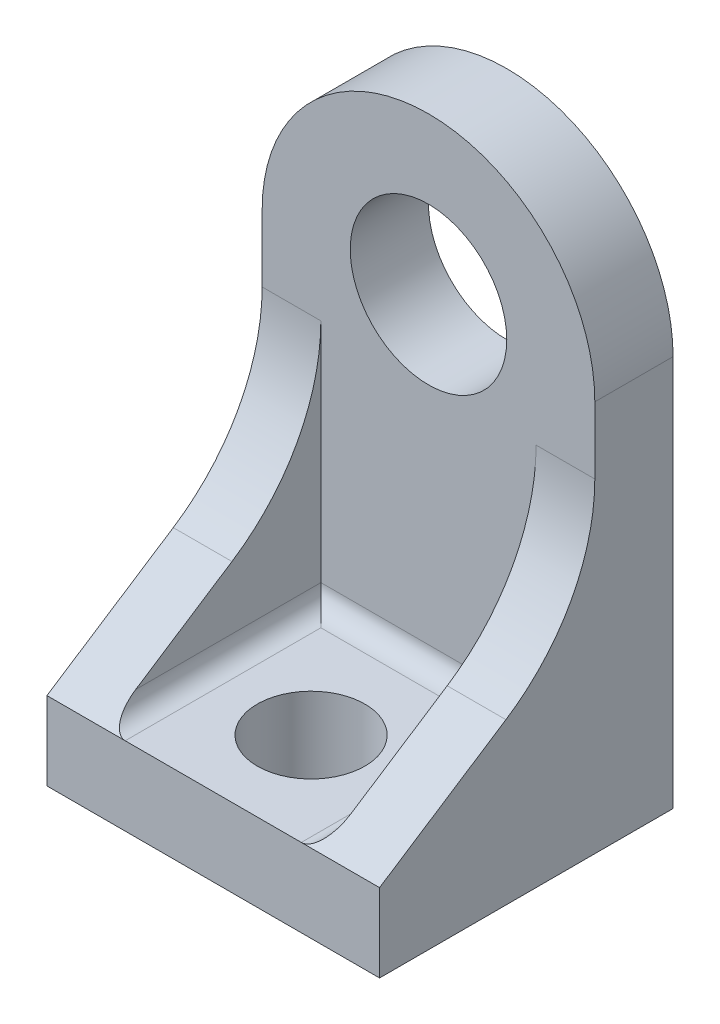
ISO-10303-21;
HEADER;
FILE_DESCRIPTION(('STEP AP214'),'2;1');
FILE_NAME('part.step','',(''),(''),'','','');
FILE_SCHEMA(('AUTOMOTIVE_DESIGN { 1 0 10303 214 1 1 1 1 }'));
ENDSEC;
DATA;
#1=APPLICATION_CONTEXT('core data for automotive mechanical design processes');
#2=APPLICATION_PROTOCOL_DEFINITION('international standard','automotive_design',2000,#1);
#3=PRODUCT_CONTEXT('',#1,'mechanical');
#4=PRODUCT('Part','Part','',(#3));
#5=PRODUCT_RELATED_PRODUCT_CATEGORY('part','',(#4));
#6=PRODUCT_DEFINITION_FORMATION('','',#4);
#7=PRODUCT_DEFINITION_CONTEXT('part definition',#1,'design');
#8=PRODUCT_DEFINITION('design','',#6,#7);
#9=PRODUCT_DEFINITION_SHAPE('','',#8);
#10=(LENGTH_UNIT() NAMED_UNIT(*) SI_UNIT(.MILLI.,.METRE.));
#11=(NAMED_UNIT(*) PLANE_ANGLE_UNIT() SI_UNIT($,.RADIAN.));
#12=(NAMED_UNIT(*) SI_UNIT($,.STERADIAN.) SOLID_ANGLE_UNIT());
#13=UNCERTAINTY_MEASURE_WITH_UNIT(LENGTH_MEASURE(1.E-05),#10,'distance_accuracy_value','');
#14=(GEOMETRIC_REPRESENTATION_CONTEXT(3) GLOBAL_UNCERTAINTY_ASSIGNED_CONTEXT((#13)) GLOBAL_UNIT_ASSIGNED_CONTEXT((#10,
#11,#12)) REPRESENTATION_CONTEXT('',''));
#15=CARTESIAN_POINT('',(0.,0.,0.));
#16=DIRECTION('',(0.,0.,1.));
#17=DIRECTION('',(1.,0.,0.));
#18=AXIS2_PLACEMENT_3D('',#15,#16,#17);
#19=CARTESIAN_POINT('',(-8.5,0.,15.));
#20=DIRECTION('',(1.,0.,0.));
#21=DIRECTION('',(0.,0.,-1.));
#22=AXIS2_PLACEMENT_3D('',#19,#20,#21);
#23=PLANE('',#22);
#24=DIRECTION('',(0.,0.545692634920528,-0.83798541048964));
#25=VECTOR('',#24,1.);
#26=CARTESIAN_POINT('',(-8.5,3.99999999999999,15.));
#27=LINE('',#26,#25);
#28=CARTESIAN_POINT('',(-8.5,3.99999999999999,15.));
#29=VERTEX_POINT('',#28);
#30=CARTESIAN_POINT('',(-8.5,8.20472374444659,8.54307365079472));
#31=VERTEX_POINT('',#30);
#32=EDGE_CURVE('E157',#29,#31,#27,.T.);
#33=ORIENTED_EDGE('',*,*,#32,.T.);
#34=CARTESIAN_POINT('',(-8.5,16.584577849343,14.));
#35=DIRECTION('',(1.,0.,0.));
#36=DIRECTION('',(0.,0.,-1.));
#37=AXIS2_PLACEMENT_3D('',#34,#35,#36);
#38=CIRCLE('',#37,10.);
#39=CARTESIAN_POINT('',(-8.50000000000001,16.584577849343,4.));
#40=VERTEX_POINT('',#39);
#41=EDGE_CURVE('E247',#31,#40,#38,.T.);
#42=ORIENTED_EDGE('',*,*,#41,.T.);
#43=DIRECTION('',(0.,1.,0.));
#44=VECTOR('',#43,1.);
#45=CARTESIAN_POINT('',(-8.5,11.1631545239176,4.));
#46=LINE('',#45,#44);
#47=CARTESIAN_POINT('',(-8.50000000000001,20.,4.));
#48=VERTEX_POINT('',#47);
#49=EDGE_CURVE('E161',#40,#48,#46,.T.);
#50=ORIENTED_EDGE('',*,*,#49,.T.);
#51=DIRECTION('',(0.,0.,-1.));
#52=VECTOR('',#51,1.);
#53=CARTESIAN_POINT('',(-8.5,20.,15.));
#54=LINE('',#53,#52);
#55=CARTESIAN_POINT('',(-8.5,20.,0.));
#56=VERTEX_POINT('',#55);
#57=EDGE_CURVE('E201',#48,#56,#54,.T.);
#58=ORIENTED_EDGE('',*,*,#57,.T.);
#59=DIRECTION('',(0.,-1.,0.));
#60=VECTOR('',#59,1.);
#61=CARTESIAN_POINT('',(-8.5,0.,0.));
#62=LINE('',#61,#60);
#63=CARTESIAN_POINT('',(-8.5,0.,0.));
#64=VERTEX_POINT('',#63);
#65=EDGE_CURVE('E186',#56,#64,#62,.T.);
#66=ORIENTED_EDGE('',*,*,#65,.T.);
#67=DIRECTION('',(0.,0.,-1.));
#68=VECTOR('',#67,1.);
#69=CARTESIAN_POINT('',(-8.5,0.,15.));
#70=LINE('',#69,#68);
#71=CARTESIAN_POINT('',(-8.5,0.,15.));
#72=VERTEX_POINT('',#71);
#73=EDGE_CURVE('E227',#72,#64,#70,.T.);
#74=ORIENTED_EDGE('',*,*,#73,.F.);
#75=DIRECTION('',(0.,-1.,0.));
#76=VECTOR('',#75,1.);
#77=CARTESIAN_POINT('',(-8.5,0.,15.));
#78=LINE('',#77,#76);
#79=EDGE_CURVE('E189',#29,#72,#78,.T.);
#80=ORIENTED_EDGE('',*,*,#79,.F.);
#81=EDGE_LOOP('',(#33,#42,#50,#58,#66,#74,#80));
#82=FACE_BOUND('',#81,.T.);
#83=ADVANCED_FACE('F39',(#82),#23,.F.);
#84=CARTESIAN_POINT('',(-8.5,0.,15.));
#85=DIRECTION('',(0.,1.,0.));
#86=DIRECTION('',(0.,0.,1.));
#87=AXIS2_PLACEMENT_3D('',#84,#85,#86);
#88=PLANE('',#87);
#89=CARTESIAN_POINT('',(0.,0.,10.));
#90=DIRECTION('',(0.,1.,0.));
#91=DIRECTION('',(0.,0.,1.));
#92=AXIS2_PLACEMENT_3D('',#89,#90,#91);
#93=CIRCLE('',#92,2.75);
#94=CARTESIAN_POINT('',(0.,0.,12.75));
#95=VERTEX_POINT('',#94);
#96=EDGE_CURVE('E141',#95,#95,#93,.T.);
#97=ORIENTED_EDGE('',*,*,#96,.T.);
#98=EDGE_LOOP('',(#97));
#99=FACE_BOUND('',#98,.T.);
#100=DIRECTION('',(1.,0.,0.));
#101=VECTOR('',#100,1.);
#102=CARTESIAN_POINT('',(-8.5,0.,0.));
#103=LINE('',#102,#101);
#104=CARTESIAN_POINT('',(8.5,0.,0.));
#105=VERTEX_POINT('',#104);
#106=EDGE_CURVE('E205',#64,#105,#103,.T.);
#107=ORIENTED_EDGE('',*,*,#106,.T.);
#108=DIRECTION('',(0.,0.,-1.));
#109=VECTOR('',#108,1.);
#110=CARTESIAN_POINT('',(8.5,0.,15.));
#111=LINE('',#110,#109);
#112=CARTESIAN_POINT('',(8.5,0.,15.));
#113=VERTEX_POINT('',#112);
#114=EDGE_CURVE('E223',#113,#105,#111,.T.);
#115=ORIENTED_EDGE('',*,*,#114,.F.);
#116=DIRECTION('',(1.,0.,0.));
#117=VECTOR('',#116,1.);
#118=CARTESIAN_POINT('',(-8.5,0.,15.));
#119=LINE('',#118,#117);
#120=EDGE_CURVE('E193',#72,#113,#119,.T.);
#121=ORIENTED_EDGE('',*,*,#120,.F.);
#122=ORIENTED_EDGE('',*,*,#73,.T.);
#123=EDGE_LOOP('',(#107,#115,#121,#122));
#124=FACE_BOUND('',#123,.T.);
#125=ADVANCED_FACE('F288',(#99,#124),#88,.F.);
#126=CARTESIAN_POINT('',(8.5,0.,15.));
#127=DIRECTION('',(-1.,0.,0.));
#128=DIRECTION('',(0.,-1.,0.));
#129=AXIS2_PLACEMENT_3D('',#126,#127,#128);
#130=PLANE('',#129);
#131=DIRECTION('',(0.,0.,-1.));
#132=VECTOR('',#131,1.);
#133=CARTESIAN_POINT('',(8.5,20.,15.));
#134=LINE('',#133,#132);
#135=CARTESIAN_POINT('',(8.49999999999999,20.,4.));
#136=VERTEX_POINT('',#135);
#137=CARTESIAN_POINT('',(8.5,20.,0.));
#138=VERTEX_POINT('',#137);
#139=EDGE_CURVE('E219',#136,#138,#134,.T.);
#140=ORIENTED_EDGE('',*,*,#139,.F.);
#141=DIRECTION('',(0.,1.,0.));
#142=VECTOR('',#141,1.);
#143=CARTESIAN_POINT('',(8.5,11.1631545239176,4.));
#144=LINE('',#143,#142);
#145=CARTESIAN_POINT('',(8.49999999999999,16.584577849343,4.));
#146=VERTEX_POINT('',#145);
#147=EDGE_CURVE('E162',#146,#136,#144,.T.);
#148=ORIENTED_EDGE('',*,*,#147,.F.);
#149=CARTESIAN_POINT('',(8.5,16.584577849343,14.));
#150=DIRECTION('',(-1.,0.,0.));
#151=DIRECTION('',(0.,-1.,0.));
#152=AXIS2_PLACEMENT_3D('',#149,#150,#151);
#153=CIRCLE('',#152,10.);
#154=CARTESIAN_POINT('',(8.5,8.20472374444659,8.54307365079472));
#155=VERTEX_POINT('',#154);
#156=EDGE_CURVE('E251',#146,#155,#153,.T.);
#157=ORIENTED_EDGE('',*,*,#156,.T.);
#158=DIRECTION('',(0.,0.545692634920528,-0.83798541048964));
#159=VECTOR('',#158,1.);
#160=CARTESIAN_POINT('',(8.5,4.,15.));
#161=LINE('',#160,#159);
#162=CARTESIAN_POINT('',(8.5,4.,15.));
#163=VERTEX_POINT('',#162);
#164=EDGE_CURVE('E145',#163,#155,#161,.T.);
#165=ORIENTED_EDGE('',*,*,#164,.F.);
#166=DIRECTION('',(0.,1.,0.));
#167=VECTOR('',#166,1.);
#168=CARTESIAN_POINT('',(8.5,0.,15.));
#169=LINE('',#168,#167);
#170=EDGE_CURVE('E198',#113,#163,#169,.T.);
#171=ORIENTED_EDGE('',*,*,#170,.F.);
#172=ORIENTED_EDGE('',*,*,#114,.T.);
#173=DIRECTION('',(0.,1.,0.));
#174=VECTOR('',#173,1.);
#175=CARTESIAN_POINT('',(8.5,0.,0.));
#176=LINE('',#175,#174);
#177=EDGE_CURVE('E209',#105,#138,#176,.T.);
#178=ORIENTED_EDGE('',*,*,#177,.T.);
#179=EDGE_LOOP('',(#140,#148,#157,#165,#171,#172,#178));
#180=FACE_BOUND('',#179,.T.);
#181=ADVANCED_FACE('F342',(#180),#130,.F.);
#182=CARTESIAN_POINT('',(0.,20.,15.));
#183=DIRECTION('',(0.,0.,-1.));
#184=DIRECTION('',(-1.,0.,0.));
#185=AXIS2_PLACEMENT_3D('',#182,#183,#184);
#186=CYLINDRICAL_SURFACE('',#185,8.5);
#187=ORIENTED_EDGE('',*,*,#57,.F.);
#188=CARTESIAN_POINT('',(0.,20.,4.));
#189=DIRECTION('',(0.,0.,1.));
#190=DIRECTION('',(-1.,0.,0.));
#191=AXIS2_PLACEMENT_3D('',#188,#189,#190);
#192=CIRCLE('',#191,8.5);
#193=EDGE_CURVE('E182',#136,#48,#192,.T.);
#194=ORIENTED_EDGE('',*,*,#193,.F.);
#195=ORIENTED_EDGE('',*,*,#139,.T.);
#196=CARTESIAN_POINT('',(0.,20.,0.));
#197=DIRECTION('',(0.,0.,1.));
#198=DIRECTION('',(-1.,0.,0.));
#199=AXIS2_PLACEMENT_3D('',#196,#197,#198);
#200=CIRCLE('',#199,8.5);
#201=EDGE_CURVE('E194',#138,#56,#200,.T.);
#202=ORIENTED_EDGE('',*,*,#201,.T.);
#203=EDGE_LOOP('',(#187,#194,#195,#202));
#204=FACE_BOUND('',#203,.T.);
#205=ADVANCED_FACE('F322',(#204),#186,.T.);
#206=CARTESIAN_POINT('',(0.,20.,15.));
#207=DIRECTION('',(0.,0.,-1.));
#208=DIRECTION('',(-1.,0.,0.));
#209=AXIS2_PLACEMENT_3D('',#206,#207,#208);
#210=PLANE('',#209);
#211=ORIENTED_EDGE('',*,*,#170,.T.);
#212=DIRECTION('',(1.,0.,0.));
#213=VECTOR('',#212,1.);
#214=CARTESIAN_POINT('',(-8.5,3.99999999999999,15.));
#215=LINE('',#214,#213);
#216=CARTESIAN_POINT('',(4.5,4.,15.));
#217=VERTEX_POINT('',#216);
#218=EDGE_CURVE('E57',#217,#163,#215,.T.);
#219=ORIENTED_EDGE('',*,*,#218,.F.);
#220=DIRECTION('',(1.,0.,0.));
#221=VECTOR('',#220,1.);
#222=CARTESIAN_POINT('',(-5.5,4.,15.));
#223=LINE('',#222,#221);
#224=CARTESIAN_POINT('',(-4.5,3.99999999999999,15.));
#225=VERTEX_POINT('',#224);
#226=EDGE_CURVE('E122',#225,#217,#223,.T.);
#227=ORIENTED_EDGE('',*,*,#226,.F.);
#228=EDGE_CURVE('E80',#29,#225,#215,.T.);
#229=ORIENTED_EDGE('',*,*,#228,.F.);
#230=ORIENTED_EDGE('',*,*,#79,.T.);
#231=ORIENTED_EDGE('',*,*,#120,.T.);
#232=EDGE_LOOP('',(#211,#219,#227,#229,#230,#231));
#233=FACE_BOUND('',#232,.T.);
#234=ADVANCED_FACE('F270',(#233),#210,.F.);
#235=CARTESIAN_POINT('',(0.,20.,0.));
#236=DIRECTION('',(0.,0.,-1.));
#237=DIRECTION('',(-1.,0.,0.));
#238=AXIS2_PLACEMENT_3D('',#235,#236,#237);
#239=PLANE('',#238);
#240=CARTESIAN_POINT('',(0.,20.5,0.));
#241=DIRECTION('',(0.,0.,1.));
#242=DIRECTION('',(1.,0.,0.));
#243=AXIS2_PLACEMENT_3D('',#240,#241,#242);
#244=CIRCLE('',#243,4.);
#245=CARTESIAN_POINT('',(4.,20.5,0.));
#246=VERTEX_POINT('',#245);
#247=EDGE_CURVE('E153',#246,#246,#244,.T.);
#248=ORIENTED_EDGE('',*,*,#247,.T.);
#249=EDGE_LOOP('',(#248));
#250=FACE_BOUND('',#249,.T.);
#251=ORIENTED_EDGE('',*,*,#65,.F.);
#252=ORIENTED_EDGE('',*,*,#201,.F.);
#253=ORIENTED_EDGE('',*,*,#177,.F.);
#254=ORIENTED_EDGE('',*,*,#106,.F.);
#255=EDGE_LOOP('',(#251,#252,#253,#254));
#256=FACE_BOUND('',#255,.T.);
#257=ADVANCED_FACE('F324',(#250,#256),#239,.T.);
#258=CARTESIAN_POINT('',(-5.5,26.4807406984079,4.));
#259=DIRECTION('',(-1.,0.,0.));
#260=DIRECTION('',(0.,-1.,0.));
#261=AXIS2_PLACEMENT_3D('',#258,#259,#260);
#262=PLANE('',#261);
#263=DIRECTION('',(0.,-0.545692634920528,0.83798541048964));
#264=VECTOR('',#263,1.);
#265=CARTESIAN_POINT('',(-5.5,15.7244322555424,-3.00446358937859));
#266=LINE('',#265,#264);
#267=CARTESIAN_POINT('',(-5.5,8.20472374444659,8.54307365079472));
#268=VERTEX_POINT('',#267);
#269=CARTESIAN_POINT('',(-5.5,5.,13.4643637152778));
#270=VERTEX_POINT('',#269);
#271=EDGE_CURVE('E106',#268,#270,#266,.T.);
#272=ORIENTED_EDGE('',*,*,#271,.T.);
#273=DIRECTION('',(0.,0.,1.));
#274=VECTOR('',#273,1.);
#275=CARTESIAN_POINT('',(-5.5,5.,4.));
#276=LINE('',#275,#274);
#277=CARTESIAN_POINT('',(-5.5,5.,4.));
#278=VERTEX_POINT('',#277);
#279=EDGE_CURVE('E118',#270,#278,#276,.F.);
#280=ORIENTED_EDGE('',*,*,#279,.T.);
#281=DIRECTION('',(0.,-1.,0.));
#282=VECTOR('',#281,1.);
#283=CARTESIAN_POINT('',(-5.5,26.4807406984079,4.));
#284=LINE('',#283,#282);
#285=CARTESIAN_POINT('',(-5.5,16.584577849343,4.));
#286=VERTEX_POINT('',#285);
#287=EDGE_CURVE('E176',#286,#278,#284,.T.);
#288=ORIENTED_EDGE('',*,*,#287,.F.);
#289=CARTESIAN_POINT('',(-5.5,16.584577849343,14.));
#290=DIRECTION('',(-1.,0.,0.));
#291=DIRECTION('',(0.,-1.,0.));
#292=AXIS2_PLACEMENT_3D('',#289,#290,#291);
#293=CIRCLE('',#292,10.);
#294=EDGE_CURVE('E120',#286,#268,#293,.T.);
#295=ORIENTED_EDGE('',*,*,#294,.T.);
#296=EDGE_LOOP('',(#272,#280,#288,#295));
#297=FACE_BOUND('',#296,.T.);
#298=ADVANCED_FACE('F116',(#297),#262,.F.);
#299=CARTESIAN_POINT('',(5.5,4.,4.));
#300=DIRECTION('',(1.,0.,0.));
#301=DIRECTION('',(0.,1.,0.));
#302=AXIS2_PLACEMENT_3D('',#299,#300,#301);
#303=PLANE('',#302);
#304=DIRECTION('',(0.,1.,0.));
#305=VECTOR('',#304,1.);
#306=CARTESIAN_POINT('',(5.5,4.,4.));
#307=LINE('',#306,#305);
#308=CARTESIAN_POINT('',(5.5,5.,4.));
#309=VERTEX_POINT('',#308);
#310=CARTESIAN_POINT('',(5.5,16.584577849343,4.));
#311=VERTEX_POINT('',#310);
#312=EDGE_CURVE('E179',#309,#311,#307,.T.);
#313=ORIENTED_EDGE('',*,*,#312,.F.);
#314=DIRECTION('',(0.,0.,1.));
#315=VECTOR('',#314,1.);
#316=CARTESIAN_POINT('',(5.5,5.,15.));
#317=LINE('',#316,#315);
#318=CARTESIAN_POINT('',(5.5,5.,13.4643637152778));
#319=VERTEX_POINT('',#318);
#320=EDGE_CURVE('E129',#309,#319,#317,.T.);
#321=ORIENTED_EDGE('',*,*,#320,.T.);
#322=DIRECTION('',(0.,0.545692634920528,-0.83798541048964));
#323=VECTOR('',#322,1.);
#324=CARTESIAN_POINT('',(5.5,9.03010713342557,7.27558496987159));
#325=LINE('',#324,#323);
#326=CARTESIAN_POINT('',(5.5,8.20472374444659,8.54307365079472));
#327=VERTEX_POINT('',#326);
#328=EDGE_CURVE('E91',#319,#327,#325,.T.);
#329=ORIENTED_EDGE('',*,*,#328,.T.);
#330=CARTESIAN_POINT('',(5.5,16.584577849343,14.));
#331=DIRECTION('',(1.,0.,0.));
#332=DIRECTION('',(0.,1.,0.));
#333=AXIS2_PLACEMENT_3D('',#330,#331,#332);
#334=CIRCLE('',#333,10.);
#335=EDGE_CURVE('E254',#327,#311,#334,.T.);
#336=ORIENTED_EDGE('',*,*,#335,.T.);
#337=EDGE_LOOP('',(#313,#321,#329,#336));
#338=FACE_BOUND('',#337,.T.);
#339=ADVANCED_FACE('F332',(#338),#303,.F.);
#340=CARTESIAN_POINT('',(-5.5,4.,4.));
#341=DIRECTION('',(0.,-1.,0.));
#342=DIRECTION('',(0.,0.,-1.));
#343=AXIS2_PLACEMENT_3D('',#340,#341,#342);
#344=PLANE('',#343);
#345=CARTESIAN_POINT('',(0.,4.,10.));
#346=DIRECTION('',(0.,1.,0.));
#347=DIRECTION('',(0.,0.,1.));
#348=AXIS2_PLACEMENT_3D('',#345,#346,#347);
#349=CIRCLE('',#348,2.75);
#350=CARTESIAN_POINT('',(0.,4.,12.75));
#351=VERTEX_POINT('',#350);
#352=EDGE_CURVE('E147',#351,#351,#349,.T.);
#353=ORIENTED_EDGE('',*,*,#352,.F.);
#354=EDGE_LOOP('',(#353));
#355=FACE_BOUND('',#354,.T.);
#356=DIRECTION('',(1.,0.,0.));
#357=VECTOR('',#356,1.);
#358=CARTESIAN_POINT('',(-5.5,4.,5.));
#359=LINE('',#358,#357);
#360=CARTESIAN_POINT('',(4.5,4.,5.));
#361=VERTEX_POINT('',#360);
#362=CARTESIAN_POINT('',(-4.5,4.,5.));
#363=VERTEX_POINT('',#362);
#364=EDGE_CURVE('E257',#361,#363,#359,.F.);
#365=ORIENTED_EDGE('',*,*,#364,.T.);
#366=DIRECTION('',(0.,0.,1.));
#367=VECTOR('',#366,1.);
#368=CARTESIAN_POINT('',(-4.5,4.,15.));
#369=LINE('',#368,#367);
#370=EDGE_CURVE('E130',#363,#225,#369,.T.);
#371=ORIENTED_EDGE('',*,*,#370,.T.);
#372=ORIENTED_EDGE('',*,*,#226,.T.);
#373=DIRECTION('',(0.,0.,1.));
#374=VECTOR('',#373,1.);
#375=CARTESIAN_POINT('',(4.5,4.,4.));
#376=LINE('',#375,#374);
#377=EDGE_CURVE('E135',#217,#361,#376,.F.);
#378=ORIENTED_EDGE('',*,*,#377,.T.);
#379=EDGE_LOOP('',(#365,#371,#372,#378));
#380=FACE_BOUND('',#379,.T.);
#381=ADVANCED_FACE('F263',(#355,#380),#344,.F.);
#382=CARTESIAN_POINT('',(0.,20.,4.));
#383=DIRECTION('',(0.,0.,-1.));
#384=DIRECTION('',(-1.,0.,0.));
#385=AXIS2_PLACEMENT_3D('',#382,#383,#384);
#386=PLANE('',#385);
#387=CARTESIAN_POINT('',(0.,20.5,4.));
#388=DIRECTION('',(0.,0.,1.));
#389=DIRECTION('',(1.,0.,0.));
#390=AXIS2_PLACEMENT_3D('',#387,#388,#389);
#391=CIRCLE('',#390,4.);
#392=CARTESIAN_POINT('',(4.,20.5,4.));
#393=VERTEX_POINT('',#392);
#394=EDGE_CURVE('E486',#393,#393,#391,.T.);
#395=ORIENTED_EDGE('',*,*,#394,.F.);
#396=EDGE_LOOP('',(#395));
#397=FACE_BOUND('',#396,.T.);
#398=ORIENTED_EDGE('',*,*,#287,.T.);
#399=DIRECTION('',(1.,0.,0.));
#400=VECTOR('',#399,1.);
#401=CARTESIAN_POINT('',(5.5,5.,4.));
#402=LINE('',#401,#400);
#403=EDGE_CURVE('E66',#278,#309,#402,.T.);
#404=ORIENTED_EDGE('',*,*,#403,.T.);
#405=ORIENTED_EDGE('',*,*,#312,.T.);
#406=DIRECTION('',(1.,0.,0.));
#407=VECTOR('',#406,1.);
#408=CARTESIAN_POINT('',(8.49999999999999,16.584577849343,4.));
#409=LINE('',#408,#407);
#410=EDGE_CURVE('E231',#311,#146,#409,.T.);
#411=ORIENTED_EDGE('',*,*,#410,.T.);
#412=ORIENTED_EDGE('',*,*,#147,.T.);
#413=ORIENTED_EDGE('',*,*,#193,.T.);
#414=ORIENTED_EDGE('',*,*,#49,.F.);
#415=DIRECTION('',(1.,0.,0.));
#416=VECTOR('',#415,1.);
#417=CARTESIAN_POINT('',(-5.5,16.584577849343,4.));
#418=LINE('',#417,#416);
#419=EDGE_CURVE('E235',#40,#286,#418,.T.);
#420=ORIENTED_EDGE('',*,*,#419,.T.);
#421=EDGE_LOOP('',(#398,#404,#405,#411,#412,#413,#414,#420));
#422=FACE_BOUND('',#421,.T.);
#423=ADVANCED_FACE('F316',(#397,#422),#386,.F.);
#424=CARTESIAN_POINT('',(-8.5,3.99999999999999,15.));
#425=DIRECTION('',(0.,-0.83798541048964,-0.545692634920528));
#426=DIRECTION('',(0.,0.545692634920528,-0.83798541048964));
#427=AXIS2_PLACEMENT_3D('',#424,#425,#426);
#428=PLANE('',#427);
#429=ORIENTED_EDGE('',*,*,#164,.T.);
#430=DIRECTION('',(1.,0.,0.));
#431=VECTOR('',#430,1.);
#432=CARTESIAN_POINT('',(5.5,8.20472374444659,8.54307365079472));
#433=LINE('',#432,#431);
#434=EDGE_CURVE('E242',#155,#327,#433,.F.);
#435=ORIENTED_EDGE('',*,*,#434,.T.);
#436=ORIENTED_EDGE('',*,*,#328,.F.);
#437=CARTESIAN_POINT('',(4.5,5.,13.4643637152778));
#438=DIRECTION('',(0.,-0.83798541048964,-0.545692634920528));
#439=DIRECTION('',(0.,0.545692634920528,-0.83798541048964));
#440=AXIS2_PLACEMENT_3D('',#437,#438,#439);
#441=ELLIPSE('',#440,1.83253343733627,1.);
#442=EDGE_CURVE('E11',#319,#217,#441,.T.);
#443=ORIENTED_EDGE('',*,*,#442,.T.);
#444=ORIENTED_EDGE('',*,*,#218,.T.);
#445=EDGE_LOOP('',(#429,#435,#436,#443,#444));
#446=FACE_BOUND('',#445,.T.);
#447=ADVANCED_FACE('F376',(#446),#428,.F.);
#448=ORIENTED_EDGE('',*,*,#271,.F.);
#449=DIRECTION('',(1.,0.,0.));
#450=VECTOR('',#449,1.);
#451=CARTESIAN_POINT('',(-8.5,8.20472374444659,8.54307365079472));
#452=LINE('',#451,#450);
#453=EDGE_CURVE('E239',#268,#31,#452,.F.);
#454=ORIENTED_EDGE('',*,*,#453,.T.);
#455=ORIENTED_EDGE('',*,*,#32,.F.);
#456=ORIENTED_EDGE('',*,*,#228,.T.);
#457=CARTESIAN_POINT('',(-4.5,5.,13.4643637152778));
#458=DIRECTION('',(0.,-0.83798541048964,-0.545692634920528));
#459=DIRECTION('',(0.,0.545692634920528,-0.83798541048964));
#460=AXIS2_PLACEMENT_3D('',#457,#458,#459);
#461=ELLIPSE('',#460,1.83253343733627,1.);
#462=EDGE_CURVE('E49',#225,#270,#461,.T.);
#463=ORIENTED_EDGE('',*,*,#462,.T.);
#464=EDGE_LOOP('',(#448,#454,#455,#456,#463));
#465=FACE_BOUND('',#464,.T.);
#466=ADVANCED_FACE('F104',(#465),#428,.F.);
#467=CARTESIAN_POINT('',(0.,16.584577849343,14.));
#468=DIRECTION('',(-1.,0.,0.));
#469=DIRECTION('',(0.,-1.,0.));
#470=AXIS2_PLACEMENT_3D('',#467,#468,#469);
#471=CYLINDRICAL_SURFACE('',#470,10.);
#472=ORIENTED_EDGE('',*,*,#41,.F.);
#473=ORIENTED_EDGE('',*,*,#453,.F.);
#474=ORIENTED_EDGE('',*,*,#294,.F.);
#475=ORIENTED_EDGE('',*,*,#419,.F.);
#476=EDGE_LOOP('',(#472,#473,#474,#475));
#477=FACE_BOUND('',#476,.T.);
#478=ADVANCED_FACE('F313',(#477),#471,.F.);
#479=CARTESIAN_POINT('',(0.,16.584577849343,14.));
#480=DIRECTION('',(-1.,0.,0.));
#481=DIRECTION('',(0.,-1.,0.));
#482=AXIS2_PLACEMENT_3D('',#479,#480,#481);
#483=CYLINDRICAL_SURFACE('',#482,10.);
#484=ORIENTED_EDGE('',*,*,#335,.F.);
#485=ORIENTED_EDGE('',*,*,#434,.F.);
#486=ORIENTED_EDGE('',*,*,#156,.F.);
#487=ORIENTED_EDGE('',*,*,#410,.F.);
#488=EDGE_LOOP('',(#484,#485,#486,#487));
#489=FACE_BOUND('',#488,.T.);
#490=ADVANCED_FACE('F348',(#489),#483,.F.);
#491=CARTESIAN_POINT('',(4.5,5.,4.));
#492=DIRECTION('',(0.,0.,-1.));
#493=DIRECTION('',(-1.,0.,0.));
#494=AXIS2_PLACEMENT_3D('',#491,#492,#493);
#495=CYLINDRICAL_SURFACE('',#494,1.);
#496=ORIENTED_EDGE('',*,*,#442,.F.);
#497=ORIENTED_EDGE('',*,*,#320,.F.);
#498=CARTESIAN_POINT('',(4.5,5.,5.));
#499=DIRECTION('',(-0.707106781186547,0.,-0.707106781186547));
#500=DIRECTION('',(0.707106781186547,0.,-0.707106781186547));
#501=AXIS2_PLACEMENT_3D('',#498,#499,#500);
#502=ELLIPSE('',#501,1.41421356237309,1.);
#503=EDGE_CURVE('E43',#361,#309,#502,.F.);
#504=ORIENTED_EDGE('',*,*,#503,.F.);
#505=ORIENTED_EDGE('',*,*,#377,.F.);
#506=EDGE_LOOP('',(#496,#497,#504,#505));
#507=FACE_BOUND('',#506,.T.);
#508=ADVANCED_FACE('F41',(#507),#495,.F.);
#509=CARTESIAN_POINT('',(0.,5.,5.));
#510=DIRECTION('',(-1.,0.,0.));
#511=DIRECTION('',(0.,0.,1.));
#512=AXIS2_PLACEMENT_3D('',#509,#510,#511);
#513=CYLINDRICAL_SURFACE('',#512,1.);
#514=ORIENTED_EDGE('',*,*,#503,.T.);
#515=ORIENTED_EDGE('',*,*,#403,.F.);
#516=CARTESIAN_POINT('',(-4.5,5.,5.));
#517=DIRECTION('',(0.707106781186547,0.,-0.707106781186547));
#518=DIRECTION('',(-0.707106781186547,0.,-0.707106781186547));
#519=AXIS2_PLACEMENT_3D('',#516,#517,#518);
#520=ELLIPSE('',#519,1.41421356237309,1.);
#521=EDGE_CURVE('E127',#363,#278,#520,.T.);
#522=ORIENTED_EDGE('',*,*,#521,.F.);
#523=ORIENTED_EDGE('',*,*,#364,.F.);
#524=EDGE_LOOP('',(#514,#515,#522,#523));
#525=FACE_BOUND('',#524,.T.);
#526=ADVANCED_FACE('F269',(#525),#513,.F.);
#527=CARTESIAN_POINT('',(-4.5,5.,4.));
#528=DIRECTION('',(0.,0.,-1.));
#529=DIRECTION('',(-1.,0.,0.));
#530=AXIS2_PLACEMENT_3D('',#527,#528,#529);
#531=CYLINDRICAL_SURFACE('',#530,1.);
#532=ORIENTED_EDGE('',*,*,#521,.T.);
#533=ORIENTED_EDGE('',*,*,#279,.F.);
#534=ORIENTED_EDGE('',*,*,#462,.F.);
#535=ORIENTED_EDGE('',*,*,#370,.F.);
#536=EDGE_LOOP('',(#532,#533,#534,#535));
#537=FACE_BOUND('',#536,.T.);
#538=ADVANCED_FACE('F125',(#537),#531,.F.);
#539=CARTESIAN_POINT('',(0.,4.,10.));
#540=DIRECTION('',(0.,1.,0.));
#541=DIRECTION('',(0.,0.,1.));
#542=AXIS2_PLACEMENT_3D('',#539,#540,#541);
#543=CYLINDRICAL_SURFACE('',#542,2.75);
#544=ORIENTED_EDGE('',*,*,#96,.F.);
#545=EDGE_LOOP('',(#544));
#546=FACE_BOUND('',#545,.T.);
#547=ORIENTED_EDGE('',*,*,#352,.T.);
#548=EDGE_LOOP('',(#547));
#549=FACE_BOUND('',#548,.T.);
#550=ADVANCED_FACE('F353',(#546,#549),#543,.F.);
#551=CARTESIAN_POINT('',(0.,20.5,0.));
#552=DIRECTION('',(0.,0.,1.));
#553=DIRECTION('',(1.,0.,0.));
#554=AXIS2_PLACEMENT_3D('',#551,#552,#553);
#555=CYLINDRICAL_SURFACE('',#554,4.);
#556=ORIENTED_EDGE('',*,*,#247,.F.);
#557=EDGE_LOOP('',(#556));
#558=FACE_BOUND('',#557,.T.);
#559=ORIENTED_EDGE('',*,*,#394,.T.);
#560=EDGE_LOOP('',(#559));
#561=FACE_BOUND('',#560,.T.);
#562=ADVANCED_FACE('F469',(#558,#561),#555,.F.);
#563=CLOSED_SHELL('',(#83,#125,#181,#205,#234,#257,#298,#339,#381,#423,#447,#466,#478,#490,#508,
#526,#538,#550,#562));
#564=MANIFOLD_SOLID_BREP('B2',#563);
#565=ADVANCED_BREP_SHAPE_REPRESENTATION('',(#18,#564),#14);
#566=SHAPE_DEFINITION_REPRESENTATION(#9,#565);
ENDSEC;
END-ISO-10303-21;
